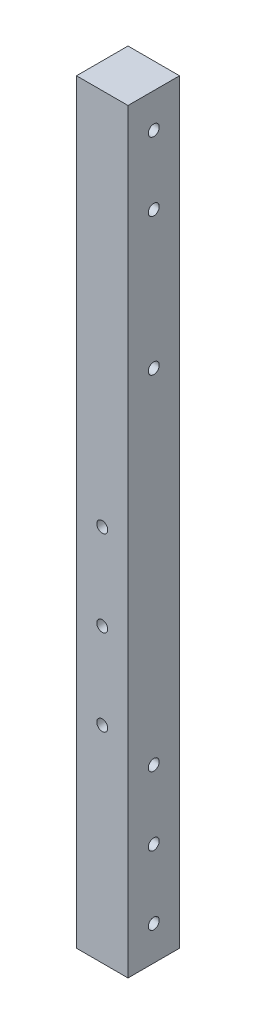
ISO-10303-21;
HEADER;
FILE_DESCRIPTION(('STEP AP214'),'2;1');
FILE_NAME('part.step','',(''),(''),'','','');
FILE_SCHEMA(('AUTOMOTIVE_DESIGN { 1 0 10303 214 1 1 1 1 }'));
ENDSEC;
DATA;
#1=APPLICATION_CONTEXT('core data for automotive mechanical design processes');
#2=APPLICATION_PROTOCOL_DEFINITION('international standard','automotive_design',2000,#1);
#3=PRODUCT_CONTEXT('',#1,'mechanical');
#4=PRODUCT('Part','Part','',(#3));
#5=PRODUCT_RELATED_PRODUCT_CATEGORY('part','',(#4));
#6=PRODUCT_DEFINITION_FORMATION('','',#4);
#7=PRODUCT_DEFINITION_CONTEXT('part definition',#1,'design');
#8=PRODUCT_DEFINITION('design','',#6,#7);
#9=PRODUCT_DEFINITION_SHAPE('','',#8);
#10=(LENGTH_UNIT() NAMED_UNIT(*) SI_UNIT(.MILLI.,.METRE.));
#11=(NAMED_UNIT(*) PLANE_ANGLE_UNIT() SI_UNIT($,.RADIAN.));
#12=(NAMED_UNIT(*) SI_UNIT($,.STERADIAN.) SOLID_ANGLE_UNIT());
#13=UNCERTAINTY_MEASURE_WITH_UNIT(LENGTH_MEASURE(1.E-05),#10,'distance_accuracy_value','');
#14=(GEOMETRIC_REPRESENTATION_CONTEXT(3) GLOBAL_UNCERTAINTY_ASSIGNED_CONTEXT((#13)) GLOBAL_UNIT_ASSIGNED_CONTEXT((#10,
#11,#12)) REPRESENTATION_CONTEXT('',''));
#15=CARTESIAN_POINT('',(0.,0.,0.));
#16=DIRECTION('',(0.,0.,1.));
#17=DIRECTION('',(1.,0.,0.));
#18=AXIS2_PLACEMENT_3D('',#15,#16,#17);
#19=CARTESIAN_POINT('',(0.,220.,0.));
#20=DIRECTION('',(1.,0.,0.));
#21=DIRECTION('',(0.,0.,-1.));
#22=AXIS2_PLACEMENT_3D('',#19,#20,#21);
#23=PLANE('',#22);
#24=DIRECTION('',(0.,0.,1.));
#25=VECTOR('',#24,1.);
#26=CARTESIAN_POINT('',(0.,0.,0.));
#27=LINE('',#26,#25);
#28=CARTESIAN_POINT('',(0.,0.,-15.));
#29=VERTEX_POINT('',#28);
#30=CARTESIAN_POINT('',(0.,0.,0.));
#31=VERTEX_POINT('',#30);
#32=EDGE_CURVE('E123',#29,#31,#27,.T.);
#33=ORIENTED_EDGE('',*,*,#32,.T.);
#34=DIRECTION('',(0.,-1.,0.));
#35=VECTOR('',#34,1.);
#36=CARTESIAN_POINT('',(0.,220.,0.));
#37=LINE('',#36,#35);
#38=CARTESIAN_POINT('',(0.,220.,0.));
#39=VERTEX_POINT('',#38);
#40=EDGE_CURVE('E12',#39,#31,#37,.T.);
#41=ORIENTED_EDGE('',*,*,#40,.F.);
#42=DIRECTION('',(0.,0.,1.));
#43=VECTOR('',#42,1.);
#44=CARTESIAN_POINT('',(0.,220.,0.));
#45=LINE('',#44,#43);
#46=CARTESIAN_POINT('',(0.,220.,-15.));
#47=VERTEX_POINT('',#46);
#48=EDGE_CURVE('E102',#47,#39,#45,.T.);
#49=ORIENTED_EDGE('',*,*,#48,.F.);
#50=DIRECTION('',(0.,-1.,0.));
#51=VECTOR('',#50,1.);
#52=CARTESIAN_POINT('',(0.,220.,-15.));
#53=LINE('',#52,#51);
#54=EDGE_CURVE('E119',#47,#29,#53,.T.);
#55=ORIENTED_EDGE('',*,*,#54,.T.);
#56=EDGE_LOOP('',(#33,#41,#49,#55));
#57=FACE_BOUND('',#56,.T.);
#58=CARTESIAN_POINT('',(-1.20000000006226E-05,50.,-7.5));
#59=DIRECTION('',(-1.,0.,0.));
#60=DIRECTION('',(0.,0.,1.));
#61=AXIS2_PLACEMENT_3D('',#58,#59,#60);
#62=CIRCLE('',#61,1.6);
#63=CARTESIAN_POINT('',(-1.20000000006226E-05,50.,-5.9));
#64=VERTEX_POINT('',#63);
#65=EDGE_CURVE('E140',#64,#64,#62,.T.);
#66=ORIENTED_EDGE('',*,*,#65,.F.);
#67=EDGE_LOOP('',(#66));
#68=FACE_BOUND('',#67,.T.);
#69=CARTESIAN_POINT('',(-1.20000000006226E-05,150.,-7.50000000000002));
#70=DIRECTION('',(-1.,0.,0.));
#71=DIRECTION('',(0.,0.,1.));
#72=AXIS2_PLACEMENT_3D('',#69,#70,#71);
#73=CIRCLE('',#72,1.59999999999999);
#74=CARTESIAN_POINT('',(-1.20000000006226E-05,150.,-5.90000000000002));
#75=VERTEX_POINT('',#74);
#76=EDGE_CURVE('E147',#75,#75,#73,.T.);
#77=ORIENTED_EDGE('',*,*,#76,.F.);
#78=EDGE_LOOP('',(#77));
#79=FACE_BOUND('',#78,.T.);
#80=CARTESIAN_POINT('',(-1.20000000006226E-05,190.,-7.50000000000002));
#81=DIRECTION('',(-1.,0.,0.));
#82=DIRECTION('',(0.,0.,1.));
#83=AXIS2_PLACEMENT_3D('',#80,#81,#82);
#84=CIRCLE('',#83,1.59999999999999);
#85=CARTESIAN_POINT('',(-1.20000000006226E-05,190.,-5.90000000000003));
#86=VERTEX_POINT('',#85);
#87=EDGE_CURVE('E162',#86,#86,#84,.T.);
#88=ORIENTED_EDGE('',*,*,#87,.F.);
#89=EDGE_LOOP('',(#88));
#90=FACE_BOUND('',#89,.T.);
#91=CARTESIAN_POINT('',(-1.20000000006226E-05,210.,-7.50000000000002));
#92=DIRECTION('',(-1.,0.,0.));
#93=DIRECTION('',(0.,0.,1.));
#94=AXIS2_PLACEMENT_3D('',#91,#92,#93);
#95=CIRCLE('',#94,1.59999999999999);
#96=CARTESIAN_POINT('',(-1.20000000006226E-05,210.,-5.90000000000003));
#97=VERTEX_POINT('',#96);
#98=EDGE_CURVE('E178',#97,#97,#95,.T.);
#99=ORIENTED_EDGE('',*,*,#98,.F.);
#100=EDGE_LOOP('',(#99));
#101=FACE_BOUND('',#100,.T.);
#102=CARTESIAN_POINT('',(-1.20000000006226E-05,30.,-7.5));
#103=DIRECTION('',(-1.,0.,0.));
#104=DIRECTION('',(0.,0.,1.));
#105=AXIS2_PLACEMENT_3D('',#102,#103,#104);
#106=CIRCLE('',#105,1.6);
#107=CARTESIAN_POINT('',(-1.20000000006226E-05,30.,-5.9));
#108=VERTEX_POINT('',#107);
#109=EDGE_CURVE('E186',#108,#108,#106,.T.);
#110=ORIENTED_EDGE('',*,*,#109,.F.);
#111=EDGE_LOOP('',(#110));
#112=FACE_BOUND('',#111,.T.);
#113=CARTESIAN_POINT('',(-1.20000000006226E-05,10.,-7.5));
#114=DIRECTION('',(-1.,0.,0.));
#115=DIRECTION('',(0.,0.,1.));
#116=AXIS2_PLACEMENT_3D('',#113,#114,#115);
#117=CIRCLE('',#116,1.6);
#118=CARTESIAN_POINT('',(-1.20000000006226E-05,10.,-5.9));
#119=VERTEX_POINT('',#118);
#120=EDGE_CURVE('E199',#119,#119,#117,.T.);
#121=ORIENTED_EDGE('',*,*,#120,.F.);
#122=EDGE_LOOP('',(#121));
#123=FACE_BOUND('',#122,.T.);
#124=ADVANCED_FACE('F48',(#57,#68,#79,#90,#101,#112,#123),#23,.F.);
#125=CARTESIAN_POINT('',(0.,220.,0.));
#126=DIRECTION('',(0.,0.,-1.));
#127=DIRECTION('',(-1.,0.,0.));
#128=AXIS2_PLACEMENT_3D('',#125,#126,#127);
#129=PLANE('',#128);
#130=CARTESIAN_POINT('',(7.5,60.,0.));
#131=DIRECTION('',(0.,0.,1.));
#132=DIRECTION('',(1.,0.,0.));
#133=AXIS2_PLACEMENT_3D('',#130,#131,#132);
#134=CIRCLE('',#133,1.6);
#135=CARTESIAN_POINT('',(9.1,60.,0.));
#136=VERTEX_POINT('',#135);
#137=EDGE_CURVE('E315',#136,#136,#134,.T.);
#138=ORIENTED_EDGE('',*,*,#137,.F.);
#139=EDGE_LOOP('',(#138));
#140=FACE_BOUND('',#139,.T.);
#141=CARTESIAN_POINT('',(7.5,85.,0.));
#142=DIRECTION('',(0.,0.,1.));
#143=DIRECTION('',(1.,0.,0.));
#144=AXIS2_PLACEMENT_3D('',#141,#142,#143);
#145=CIRCLE('',#144,1.6);
#146=CARTESIAN_POINT('',(9.1,85.,0.));
#147=VERTEX_POINT('',#146);
#148=EDGE_CURVE('E316',#147,#147,#145,.T.);
#149=ORIENTED_EDGE('',*,*,#148,.F.);
#150=EDGE_LOOP('',(#149));
#151=FACE_BOUND('',#150,.T.);
#152=CARTESIAN_POINT('',(7.5,110.,0.));
#153=DIRECTION('',(0.,0.,1.));
#154=DIRECTION('',(1.,0.,0.));
#155=AXIS2_PLACEMENT_3D('',#152,#153,#154);
#156=CIRCLE('',#155,1.6);
#157=CARTESIAN_POINT('',(9.1,110.,0.));
#158=VERTEX_POINT('',#157);
#159=EDGE_CURVE('E322',#158,#158,#156,.T.);
#160=ORIENTED_EDGE('',*,*,#159,.F.);
#161=EDGE_LOOP('',(#160));
#162=FACE_BOUND('',#161,.T.);
#163=DIRECTION('',(1.,0.,0.));
#164=VECTOR('',#163,1.);
#165=CARTESIAN_POINT('',(0.,0.,0.));
#166=LINE('',#165,#164);
#167=CARTESIAN_POINT('',(15.,0.,0.));
#168=VERTEX_POINT('',#167);
#169=EDGE_CURVE('E108',#31,#168,#166,.T.);
#170=ORIENTED_EDGE('',*,*,#169,.T.);
#171=DIRECTION('',(0.,-1.,0.));
#172=VECTOR('',#171,1.);
#173=CARTESIAN_POINT('',(15.,220.,0.));
#174=LINE('',#173,#172);
#175=CARTESIAN_POINT('',(15.,220.,0.));
#176=VERTEX_POINT('',#175);
#177=EDGE_CURVE('E58',#176,#168,#174,.T.);
#178=ORIENTED_EDGE('',*,*,#177,.F.);
#179=DIRECTION('',(1.,0.,0.));
#180=VECTOR('',#179,1.);
#181=CARTESIAN_POINT('',(0.,220.,0.));
#182=LINE('',#181,#180);
#183=EDGE_CURVE('E97',#39,#176,#182,.T.);
#184=ORIENTED_EDGE('',*,*,#183,.F.);
#185=ORIENTED_EDGE('',*,*,#40,.T.);
#186=EDGE_LOOP('',(#170,#178,#184,#185));
#187=FACE_BOUND('',#186,.T.);
#188=ADVANCED_FACE('F107',(#140,#151,#162,#187),#129,.F.);
#189=CARTESIAN_POINT('',(15.,220.,0.));
#190=DIRECTION('',(-1.,0.,0.));
#191=DIRECTION('',(0.,0.,1.));
#192=AXIS2_PLACEMENT_3D('',#189,#190,#191);
#193=PLANE('',#192);
#194=CARTESIAN_POINT('',(15.,10.,-7.5));
#195=DIRECTION('',(-1.,0.,0.));
#196=DIRECTION('',(0.,0.,1.));
#197=AXIS2_PLACEMENT_3D('',#194,#195,#196);
#198=CIRCLE('',#197,1.6);
#199=CARTESIAN_POINT('',(15.,10.,-5.9));
#200=VERTEX_POINT('',#199);
#201=EDGE_CURVE('E204',#200,#200,#198,.T.);
#202=ORIENTED_EDGE('',*,*,#201,.T.);
#203=EDGE_LOOP('',(#202));
#204=FACE_BOUND('',#203,.T.);
#205=CARTESIAN_POINT('',(15.,30.,-7.5));
#206=DIRECTION('',(-1.,0.,0.));
#207=DIRECTION('',(0.,0.,1.));
#208=AXIS2_PLACEMENT_3D('',#205,#206,#207);
#209=CIRCLE('',#208,1.6);
#210=CARTESIAN_POINT('',(15.,30.,-5.9));
#211=VERTEX_POINT('',#210);
#212=EDGE_CURVE('E213',#211,#211,#209,.T.);
#213=ORIENTED_EDGE('',*,*,#212,.T.);
#214=EDGE_LOOP('',(#213));
#215=FACE_BOUND('',#214,.T.);
#216=CARTESIAN_POINT('',(15.,210.,-7.50000000000002));
#217=DIRECTION('',(-1.,0.,0.));
#218=DIRECTION('',(0.,0.,1.));
#219=AXIS2_PLACEMENT_3D('',#216,#217,#218);
#220=CIRCLE('',#219,1.59999999999999);
#221=CARTESIAN_POINT('',(15.,210.,-5.90000000000003));
#222=VERTEX_POINT('',#221);
#223=EDGE_CURVE('E219',#222,#222,#220,.T.);
#224=ORIENTED_EDGE('',*,*,#223,.T.);
#225=EDGE_LOOP('',(#224));
#226=FACE_BOUND('',#225,.T.);
#227=CARTESIAN_POINT('',(15.,190.,-7.50000000000002));
#228=DIRECTION('',(-1.,0.,0.));
#229=DIRECTION('',(0.,0.,1.));
#230=AXIS2_PLACEMENT_3D('',#227,#228,#229);
#231=CIRCLE('',#230,1.59999999999999);
#232=CARTESIAN_POINT('',(15.,190.,-5.90000000000003));
#233=VERTEX_POINT('',#232);
#234=EDGE_CURVE('E221',#233,#233,#231,.T.);
#235=ORIENTED_EDGE('',*,*,#234,.T.);
#236=EDGE_LOOP('',(#235));
#237=FACE_BOUND('',#236,.T.);
#238=CARTESIAN_POINT('',(15.,150.,-7.50000000000002));
#239=DIRECTION('',(-1.,0.,0.));
#240=DIRECTION('',(0.,0.,1.));
#241=AXIS2_PLACEMENT_3D('',#238,#239,#240);
#242=CIRCLE('',#241,1.59999999999999);
#243=CARTESIAN_POINT('',(15.,150.,-5.90000000000002));
#244=VERTEX_POINT('',#243);
#245=EDGE_CURVE('E216',#244,#244,#242,.T.);
#246=ORIENTED_EDGE('',*,*,#245,.T.);
#247=EDGE_LOOP('',(#246));
#248=FACE_BOUND('',#247,.T.);
#249=CARTESIAN_POINT('',(15.,50.,-7.5));
#250=DIRECTION('',(-1.,0.,0.));
#251=DIRECTION('',(0.,0.,1.));
#252=AXIS2_PLACEMENT_3D('',#249,#250,#251);
#253=CIRCLE('',#252,1.6);
#254=CARTESIAN_POINT('',(15.,50.,-5.9));
#255=VERTEX_POINT('',#254);
#256=EDGE_CURVE('E210',#255,#255,#253,.T.);
#257=ORIENTED_EDGE('',*,*,#256,.T.);
#258=EDGE_LOOP('',(#257));
#259=FACE_BOUND('',#258,.T.);
#260=DIRECTION('',(0.,0.,-1.));
#261=VECTOR('',#260,1.);
#262=CARTESIAN_POINT('',(15.,0.,0.));
#263=LINE('',#262,#261);
#264=CARTESIAN_POINT('',(15.,0.,-15.));
#265=VERTEX_POINT('',#264);
#266=EDGE_CURVE('E88',#168,#265,#263,.T.);
#267=ORIENTED_EDGE('',*,*,#266,.T.);
#268=DIRECTION('',(0.,-1.,0.));
#269=VECTOR('',#268,1.);
#270=CARTESIAN_POINT('',(15.,220.,-15.));
#271=LINE('',#270,#269);
#272=CARTESIAN_POINT('',(15.,220.,-15.));
#273=VERTEX_POINT('',#272);
#274=EDGE_CURVE('E112',#273,#265,#271,.T.);
#275=ORIENTED_EDGE('',*,*,#274,.F.);
#276=DIRECTION('',(0.,0.,-1.));
#277=VECTOR('',#276,1.);
#278=CARTESIAN_POINT('',(15.,220.,0.));
#279=LINE('',#278,#277);
#280=EDGE_CURVE('E105',#176,#273,#279,.T.);
#281=ORIENTED_EDGE('',*,*,#280,.F.);
#282=ORIENTED_EDGE('',*,*,#177,.T.);
#283=EDGE_LOOP('',(#267,#275,#281,#282));
#284=FACE_BOUND('',#283,.T.);
#285=ADVANCED_FACE('F114',(#204,#215,#226,#237,#248,#259,#284),#193,.F.);
#286=CARTESIAN_POINT('',(0.,220.,-15.));
#287=DIRECTION('',(0.,0.,1.));
#288=DIRECTION('',(1.,0.,0.));
#289=AXIS2_PLACEMENT_3D('',#286,#287,#288);
#290=PLANE('',#289);
#291=CARTESIAN_POINT('',(7.5,60.,-15.));
#292=DIRECTION('',(0.,0.,1.));
#293=DIRECTION('',(1.,0.,0.));
#294=AXIS2_PLACEMENT_3D('',#291,#292,#293);
#295=CIRCLE('',#294,1.6);
#296=CARTESIAN_POINT('',(9.1,60.,-15.));
#297=VERTEX_POINT('',#296);
#298=EDGE_CURVE('E127',#297,#297,#295,.T.);
#299=ORIENTED_EDGE('',*,*,#298,.T.);
#300=EDGE_LOOP('',(#299));
#301=FACE_BOUND('',#300,.T.);
#302=CARTESIAN_POINT('',(7.5,85.,-15.));
#303=DIRECTION('',(0.,0.,1.));
#304=DIRECTION('',(1.,0.,0.));
#305=AXIS2_PLACEMENT_3D('',#302,#303,#304);
#306=CIRCLE('',#305,1.6);
#307=CARTESIAN_POINT('',(9.1,85.,-15.));
#308=VERTEX_POINT('',#307);
#309=EDGE_CURVE('E319',#308,#308,#306,.T.);
#310=ORIENTED_EDGE('',*,*,#309,.T.);
#311=EDGE_LOOP('',(#310));
#312=FACE_BOUND('',#311,.T.);
#313=CARTESIAN_POINT('',(7.5,110.,-15.));
#314=DIRECTION('',(0.,0.,1.));
#315=DIRECTION('',(1.,0.,0.));
#316=AXIS2_PLACEMENT_3D('',#313,#314,#315);
#317=CIRCLE('',#316,1.6);
#318=CARTESIAN_POINT('',(9.1,110.,-15.));
#319=VERTEX_POINT('',#318);
#320=EDGE_CURVE('E228',#319,#319,#317,.T.);
#321=ORIENTED_EDGE('',*,*,#320,.T.);
#322=EDGE_LOOP('',(#321));
#323=FACE_BOUND('',#322,.T.);
#324=DIRECTION('',(-1.,0.,0.));
#325=VECTOR('',#324,1.);
#326=CARTESIAN_POINT('',(0.,0.,-15.));
#327=LINE('',#326,#325);
#328=EDGE_CURVE('E95',#265,#29,#327,.T.);
#329=ORIENTED_EDGE('',*,*,#328,.T.);
#330=ORIENTED_EDGE('',*,*,#54,.F.);
#331=DIRECTION('',(-1.,0.,0.));
#332=VECTOR('',#331,1.);
#333=CARTESIAN_POINT('',(0.,220.,-15.));
#334=LINE('',#333,#332);
#335=EDGE_CURVE('E67',#273,#47,#334,.T.);
#336=ORIENTED_EDGE('',*,*,#335,.F.);
#337=ORIENTED_EDGE('',*,*,#274,.T.);
#338=EDGE_LOOP('',(#329,#330,#336,#337));
#339=FACE_BOUND('',#338,.T.);
#340=ADVANCED_FACE('F340',(#301,#312,#323,#339),#290,.F.);
#341=CARTESIAN_POINT('',(0.,220.,0.));
#342=DIRECTION('',(0.,-1.,0.));
#343=DIRECTION('',(0.,0.,-1.));
#344=AXIS2_PLACEMENT_3D('',#341,#342,#343);
#345=PLANE('',#344);
#346=ORIENTED_EDGE('',*,*,#48,.T.);
#347=ORIENTED_EDGE('',*,*,#183,.T.);
#348=ORIENTED_EDGE('',*,*,#280,.T.);
#349=ORIENTED_EDGE('',*,*,#335,.T.);
#350=EDGE_LOOP('',(#346,#347,#348,#349));
#351=FACE_BOUND('',#350,.T.);
#352=ADVANCED_FACE('F99',(#351),#345,.F.);
#353=CARTESIAN_POINT('',(0.,0.,0.));
#354=DIRECTION('',(0.,-1.,0.));
#355=DIRECTION('',(0.,0.,-1.));
#356=AXIS2_PLACEMENT_3D('',#353,#354,#355);
#357=PLANE('',#356);
#358=ORIENTED_EDGE('',*,*,#32,.F.);
#359=ORIENTED_EDGE('',*,*,#328,.F.);
#360=ORIENTED_EDGE('',*,*,#266,.F.);
#361=ORIENTED_EDGE('',*,*,#169,.F.);
#362=EDGE_LOOP('',(#358,#359,#360,#361));
#363=FACE_BOUND('',#362,.T.);
#364=ADVANCED_FACE('F343',(#363),#357,.T.);
#365=CARTESIAN_POINT('',(7.5,110.,-15.));
#366=DIRECTION('',(0.,0.,1.));
#367=DIRECTION('',(1.,0.,0.));
#368=AXIS2_PLACEMENT_3D('',#365,#366,#367);
#369=CYLINDRICAL_SURFACE('',#368,1.6);
#370=ORIENTED_EDGE('',*,*,#320,.F.);
#371=EDGE_LOOP('',(#370));
#372=FACE_BOUND('',#371,.T.);
#373=ORIENTED_EDGE('',*,*,#159,.T.);
#374=EDGE_LOOP('',(#373));
#375=FACE_BOUND('',#374,.T.);
#376=ADVANCED_FACE('F363',(#372,#375),#369,.F.);
#377=CARTESIAN_POINT('',(7.5,85.,-15.));
#378=DIRECTION('',(0.,0.,1.));
#379=DIRECTION('',(1.,0.,0.));
#380=AXIS2_PLACEMENT_3D('',#377,#378,#379);
#381=CYLINDRICAL_SURFACE('',#380,1.6);
#382=ORIENTED_EDGE('',*,*,#309,.F.);
#383=EDGE_LOOP('',(#382));
#384=FACE_BOUND('',#383,.T.);
#385=ORIENTED_EDGE('',*,*,#148,.T.);
#386=EDGE_LOOP('',(#385));
#387=FACE_BOUND('',#386,.T.);
#388=ADVANCED_FACE('F364',(#384,#387),#381,.F.);
#389=CARTESIAN_POINT('',(7.5,60.,-15.));
#390=DIRECTION('',(0.,0.,1.));
#391=DIRECTION('',(1.,0.,0.));
#392=AXIS2_PLACEMENT_3D('',#389,#390,#391);
#393=CYLINDRICAL_SURFACE('',#392,1.6);
#394=ORIENTED_EDGE('',*,*,#298,.F.);
#395=EDGE_LOOP('',(#394));
#396=FACE_BOUND('',#395,.T.);
#397=ORIENTED_EDGE('',*,*,#137,.T.);
#398=EDGE_LOOP('',(#397));
#399=FACE_BOUND('',#398,.T.);
#400=ADVANCED_FACE('F297',(#396,#399),#393,.F.);
#401=CARTESIAN_POINT('',(15.,50.,-7.5));
#402=DIRECTION('',(-1.,0.,0.));
#403=DIRECTION('',(0.,0.,1.));
#404=AXIS2_PLACEMENT_3D('',#401,#402,#403);
#405=CYLINDRICAL_SURFACE('',#404,1.6);
#406=ORIENTED_EDGE('',*,*,#256,.F.);
#407=EDGE_LOOP('',(#406));
#408=FACE_BOUND('',#407,.T.);
#409=ORIENTED_EDGE('',*,*,#65,.T.);
#410=EDGE_LOOP('',(#409));
#411=FACE_BOUND('',#410,.T.);
#412=ADVANCED_FACE('F295',(#408,#411),#405,.F.);
#413=CARTESIAN_POINT('',(15.,150.,-7.50000000000002));
#414=DIRECTION('',(-1.,0.,0.));
#415=DIRECTION('',(0.,0.,1.));
#416=AXIS2_PLACEMENT_3D('',#413,#414,#415);
#417=CYLINDRICAL_SURFACE('',#416,1.59999999999999);
#418=ORIENTED_EDGE('',*,*,#245,.F.);
#419=EDGE_LOOP('',(#418));
#420=FACE_BOUND('',#419,.T.);
#421=ORIENTED_EDGE('',*,*,#76,.T.);
#422=EDGE_LOOP('',(#421));
#423=FACE_BOUND('',#422,.T.);
#424=ADVANCED_FACE('F247',(#420,#423),#417,.F.);
#425=CARTESIAN_POINT('',(15.,190.,-7.50000000000002));
#426=DIRECTION('',(-1.,0.,0.));
#427=DIRECTION('',(0.,0.,1.));
#428=AXIS2_PLACEMENT_3D('',#425,#426,#427);
#429=CYLINDRICAL_SURFACE('',#428,1.59999999999999);
#430=ORIENTED_EDGE('',*,*,#234,.F.);
#431=EDGE_LOOP('',(#430));
#432=FACE_BOUND('',#431,.T.);
#433=ORIENTED_EDGE('',*,*,#87,.T.);
#434=EDGE_LOOP('',(#433));
#435=FACE_BOUND('',#434,.T.);
#436=ADVANCED_FACE('F284',(#432,#435),#429,.F.);
#437=CARTESIAN_POINT('',(15.,210.,-7.50000000000002));
#438=DIRECTION('',(-1.,0.,0.));
#439=DIRECTION('',(0.,0.,1.));
#440=AXIS2_PLACEMENT_3D('',#437,#438,#439);
#441=CYLINDRICAL_SURFACE('',#440,1.59999999999999);
#442=ORIENTED_EDGE('',*,*,#223,.F.);
#443=EDGE_LOOP('',(#442));
#444=FACE_BOUND('',#443,.T.);
#445=ORIENTED_EDGE('',*,*,#98,.T.);
#446=EDGE_LOOP('',(#445));
#447=FACE_BOUND('',#446,.T.);
#448=ADVANCED_FACE('F255',(#444,#447),#441,.F.);
#449=CARTESIAN_POINT('',(15.,30.,-7.5));
#450=DIRECTION('',(-1.,0.,0.));
#451=DIRECTION('',(0.,0.,1.));
#452=AXIS2_PLACEMENT_3D('',#449,#450,#451);
#453=CYLINDRICAL_SURFACE('',#452,1.6);
#454=ORIENTED_EDGE('',*,*,#212,.F.);
#455=EDGE_LOOP('',(#454));
#456=FACE_BOUND('',#455,.T.);
#457=ORIENTED_EDGE('',*,*,#109,.T.);
#458=EDGE_LOOP('',(#457));
#459=FACE_BOUND('',#458,.T.);
#460=ADVANCED_FACE('F250',(#456,#459),#453,.F.);
#461=CARTESIAN_POINT('',(15.,10.,-7.5));
#462=DIRECTION('',(-1.,0.,0.));
#463=DIRECTION('',(0.,0.,1.));
#464=AXIS2_PLACEMENT_3D('',#461,#462,#463);
#465=CYLINDRICAL_SURFACE('',#464,1.6);
#466=ORIENTED_EDGE('',*,*,#201,.F.);
#467=EDGE_LOOP('',(#466));
#468=FACE_BOUND('',#467,.T.);
#469=ORIENTED_EDGE('',*,*,#120,.T.);
#470=EDGE_LOOP('',(#469));
#471=FACE_BOUND('',#470,.T.);
#472=ADVANCED_FACE('F240',(#468,#471),#465,.F.);
#473=CLOSED_SHELL('',(#124,#188,#285,#340,#352,#364,#376,#388,#400,#412,#424,#436,#448,#460,#472));
#474=MANIFOLD_SOLID_BREP('B2',#473);
#475=ADVANCED_BREP_SHAPE_REPRESENTATION('',(#18,#474),#14);
#476=SHAPE_DEFINITION_REPRESENTATION(#9,#475);
ENDSEC;
END-ISO-10303-21;
